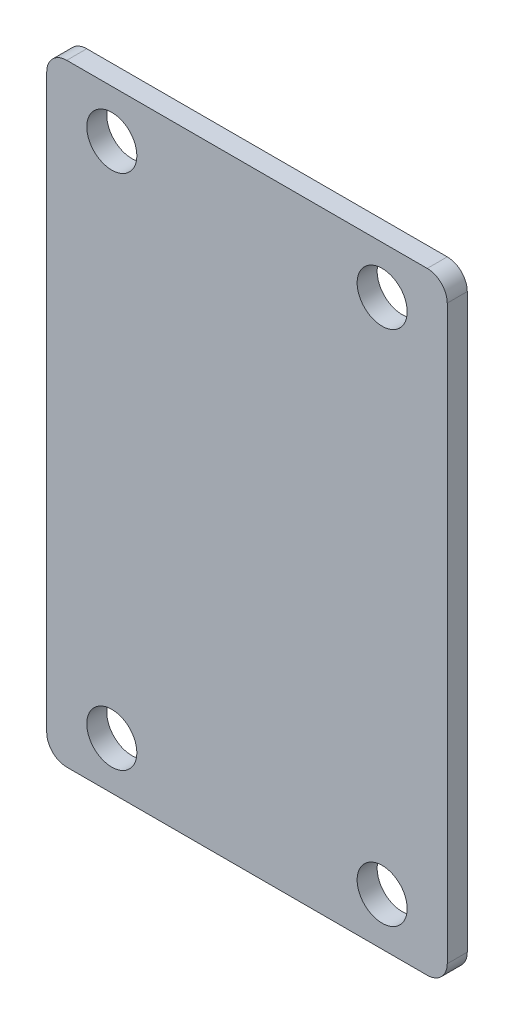
ISO-10303-21;
HEADER;
FILE_DESCRIPTION(('STEP AP214'),'2;1');
FILE_NAME('part.step','',(''),(''),'','','');
FILE_SCHEMA(('AUTOMOTIVE_DESIGN { 1 0 10303 214 1 1 1 1 }'));
ENDSEC;
DATA;
#1=APPLICATION_CONTEXT('core data for automotive mechanical design processes');
#2=APPLICATION_PROTOCOL_DEFINITION('international standard','automotive_design',2000,#1);
#3=PRODUCT_CONTEXT('',#1,'mechanical');
#4=PRODUCT('Part','Part','',(#3));
#5=PRODUCT_RELATED_PRODUCT_CATEGORY('part','',(#4));
#6=PRODUCT_DEFINITION_FORMATION('','',#4);
#7=PRODUCT_DEFINITION_CONTEXT('part definition',#1,'design');
#8=PRODUCT_DEFINITION('design','',#6,#7);
#9=PRODUCT_DEFINITION_SHAPE('','',#8);
#10=(LENGTH_UNIT() NAMED_UNIT(*) SI_UNIT(.MILLI.,.METRE.));
#11=(NAMED_UNIT(*) PLANE_ANGLE_UNIT() SI_UNIT($,.RADIAN.));
#12=(NAMED_UNIT(*) SI_UNIT($,.STERADIAN.) SOLID_ANGLE_UNIT());
#13=UNCERTAINTY_MEASURE_WITH_UNIT(LENGTH_MEASURE(1.E-05),#10,'distance_accuracy_value','');
#14=(GEOMETRIC_REPRESENTATION_CONTEXT(3) GLOBAL_UNCERTAINTY_ASSIGNED_CONTEXT((#13)) GLOBAL_UNIT_ASSIGNED_CONTEXT((#10,
#11,#12)) REPRESENTATION_CONTEXT('',''));
#15=CARTESIAN_POINT('',(0.,0.,0.));
#16=DIRECTION('',(0.,0.,1.));
#17=DIRECTION('',(1.,0.,0.));
#18=AXIS2_PLACEMENT_3D('',#15,#16,#17);
#19=CARTESIAN_POINT('',(-1.,14.2836608964063,1.));
#20=DIRECTION('',(0.,0.,1.));
#21=DIRECTION('',(1.,0.,0.));
#22=AXIS2_PLACEMENT_3D('',#19,#20,#21);
#23=PLANE('',#22);
#24=CARTESIAN_POINT('',(-3.25,12.9080282730666,1.));
#25=DIRECTION('',(0.,0.,1.));
#26=DIRECTION('',(1.,0.,0.));
#27=AXIS2_PLACEMENT_3D('',#24,#25,#26);
#28=CIRCLE('',#27,1.25);
#29=CARTESIAN_POINT('',(-2.,12.9080282730666,1.));
#30=VERTEX_POINT('',#29);
#31=EDGE_CURVE('E194',#30,#30,#28,.T.);
#32=ORIENTED_EDGE('',*,*,#31,.F.);
#33=EDGE_LOOP('',(#32));
#34=FACE_BOUND('',#33,.T.);
#35=CARTESIAN_POINT('',(-16.75,-12.9080282730667,1.));
#36=DIRECTION('',(0.,0.,1.));
#37=DIRECTION('',(1.,0.,0.));
#38=AXIS2_PLACEMENT_3D('',#35,#36,#37);
#39=CIRCLE('',#38,1.25);
#40=CARTESIAN_POINT('',(-15.5,-12.9080282730667,1.));
#41=VERTEX_POINT('',#40);
#42=EDGE_CURVE('E141',#41,#41,#39,.T.);
#43=ORIENTED_EDGE('',*,*,#42,.F.);
#44=EDGE_LOOP('',(#43));
#45=FACE_BOUND('',#44,.T.);
#46=CARTESIAN_POINT('',(-1.,14.2836608964063,1.));
#47=DIRECTION('',(0.,0.,1.));
#48=DIRECTION('',(1.,0.,0.));
#49=AXIS2_PLACEMENT_3D('',#46,#47,#48);
#50=CIRCLE('',#49,1.);
#51=CARTESIAN_POINT('',(0.,14.2836608964063,1.));
#52=VERTEX_POINT('',#51);
#53=CARTESIAN_POINT('',(-1.,15.2836608964063,1.));
#54=VERTEX_POINT('',#53);
#55=EDGE_CURVE('E154',#52,#54,#50,.T.);
#56=ORIENTED_EDGE('',*,*,#55,.T.);
#57=DIRECTION('',(-1.,0.,0.));
#58=VECTOR('',#57,1.);
#59=CARTESIAN_POINT('',(-19.,15.2836608964063,1.));
#60=LINE('',#59,#58);
#61=CARTESIAN_POINT('',(-19.,15.2836608964063,1.));
#62=VERTEX_POINT('',#61);
#63=EDGE_CURVE('E97',#54,#62,#60,.T.);
#64=ORIENTED_EDGE('',*,*,#63,.T.);
#65=CARTESIAN_POINT('',(-19.,14.2836608964063,1.));
#66=DIRECTION('',(0.,0.,1.));
#67=DIRECTION('',(1.,0.,0.));
#68=AXIS2_PLACEMENT_3D('',#65,#66,#67);
#69=CIRCLE('',#68,1.);
#70=CARTESIAN_POINT('',(-20.,14.2836608964063,1.));
#71=VERTEX_POINT('',#70);
#72=EDGE_CURVE('E169',#62,#71,#69,.T.);
#73=ORIENTED_EDGE('',*,*,#72,.T.);
#74=DIRECTION('',(0.,-1.,0.));
#75=VECTOR('',#74,1.);
#76=CARTESIAN_POINT('',(-20.,-7.24669531359351,1.));
#77=LINE('',#76,#75);
#78=CARTESIAN_POINT('',(-20.,-14.2836608964064,1.));
#79=VERTEX_POINT('',#78);
#80=EDGE_CURVE('E179',#71,#79,#77,.T.);
#81=ORIENTED_EDGE('',*,*,#80,.T.);
#82=CARTESIAN_POINT('',(-19.,-14.2836608964064,1.));
#83=DIRECTION('',(0.,0.,1.));
#84=DIRECTION('',(1.,0.,0.));
#85=AXIS2_PLACEMENT_3D('',#82,#83,#84);
#86=CIRCLE('',#85,1.);
#87=CARTESIAN_POINT('',(-19.,-15.2836608964064,1.));
#88=VERTEX_POINT('',#87);
#89=EDGE_CURVE('E117',#79,#88,#86,.T.);
#90=ORIENTED_EDGE('',*,*,#89,.T.);
#91=DIRECTION('',(1.,0.,0.));
#92=VECTOR('',#91,1.);
#93=CARTESIAN_POINT('',(-1.,-15.2836608964064,1.));
#94=LINE('',#93,#92);
#95=CARTESIAN_POINT('',(-1.,-15.2836608964064,1.));
#96=VERTEX_POINT('',#95);
#97=EDGE_CURVE('E110',#88,#96,#94,.T.);
#98=ORIENTED_EDGE('',*,*,#97,.T.);
#99=CARTESIAN_POINT('',(-1.,-14.2836608964064,1.));
#100=DIRECTION('',(0.,0.,1.));
#101=DIRECTION('',(1.,0.,0.));
#102=AXIS2_PLACEMENT_3D('',#99,#100,#101);
#103=CIRCLE('',#102,1.);
#104=CARTESIAN_POINT('',(0.,-14.2836608964064,1.));
#105=VERTEX_POINT('',#104);
#106=EDGE_CURVE('E114',#96,#105,#103,.T.);
#107=ORIENTED_EDGE('',*,*,#106,.T.);
#108=DIRECTION('',(0.,1.,0.));
#109=VECTOR('',#108,1.);
#110=CARTESIAN_POINT('',(0.,-7.24669531359351,1.));
#111=LINE('',#110,#109);
#112=EDGE_CURVE('E56',#105,#52,#111,.T.);
#113=ORIENTED_EDGE('',*,*,#112,.T.);
#114=EDGE_LOOP('',(#56,#64,#73,#81,#90,#98,#107,#113));
#115=FACE_BOUND('',#114,.T.);
#116=CARTESIAN_POINT('',(-3.25,-12.9080282730667,1.));
#117=DIRECTION('',(0.,0.,1.));
#118=DIRECTION('',(1.,0.,0.));
#119=AXIS2_PLACEMENT_3D('',#116,#117,#118);
#120=CIRCLE('',#119,1.25);
#121=CARTESIAN_POINT('',(-2.,-12.9080282730667,1.));
#122=VERTEX_POINT('',#121);
#123=EDGE_CURVE('E188',#122,#122,#120,.T.);
#124=ORIENTED_EDGE('',*,*,#123,.F.);
#125=EDGE_LOOP('',(#124));
#126=FACE_BOUND('',#125,.T.);
#127=CARTESIAN_POINT('',(-16.75,12.9080282730666,1.));
#128=DIRECTION('',(0.,0.,1.));
#129=DIRECTION('',(1.,0.,0.));
#130=AXIS2_PLACEMENT_3D('',#127,#128,#129);
#131=CIRCLE('',#130,1.25);
#132=CARTESIAN_POINT('',(-15.5,12.9080282730666,1.));
#133=VERTEX_POINT('',#132);
#134=EDGE_CURVE('E200',#133,#133,#131,.T.);
#135=ORIENTED_EDGE('',*,*,#134,.F.);
#136=EDGE_LOOP('',(#135));
#137=FACE_BOUND('',#136,.T.);
#138=ADVANCED_FACE('F39',(#34,#45,#115,#126,#137),#23,.T.);
#139=CARTESIAN_POINT('',(-1.,14.2836608964063,0.));
#140=DIRECTION('',(0.,0.,1.));
#141=DIRECTION('',(1.,0.,0.));
#142=AXIS2_PLACEMENT_3D('',#139,#140,#141);
#143=PLANE('',#142);
#144=CARTESIAN_POINT('',(-1.,14.2836608964063,0.));
#145=DIRECTION('',(0.,0.,1.));
#146=DIRECTION('',(1.,0.,0.));
#147=AXIS2_PLACEMENT_3D('',#144,#145,#146);
#148=CIRCLE('',#147,1.);
#149=CARTESIAN_POINT('',(0.,14.2836608964063,0.));
#150=VERTEX_POINT('',#149);
#151=CARTESIAN_POINT('',(-1.,15.2836608964063,0.));
#152=VERTEX_POINT('',#151);
#153=EDGE_CURVE('E137',#150,#152,#148,.T.);
#154=ORIENTED_EDGE('',*,*,#153,.F.);
#155=DIRECTION('',(0.,1.,0.));
#156=VECTOR('',#155,1.);
#157=CARTESIAN_POINT('',(0.,14.2836608964063,0.));
#158=LINE('',#157,#156);
#159=CARTESIAN_POINT('',(0.,-14.2836608964064,0.));
#160=VERTEX_POINT('',#159);
#161=EDGE_CURVE('E85',#160,#150,#158,.T.);
#162=ORIENTED_EDGE('',*,*,#161,.F.);
#163=CARTESIAN_POINT('',(-1.,-14.2836608964064,0.));
#164=DIRECTION('',(0.,0.,1.));
#165=DIRECTION('',(1.,0.,0.));
#166=AXIS2_PLACEMENT_3D('',#163,#164,#165);
#167=CIRCLE('',#166,1.);
#168=CARTESIAN_POINT('',(-1.,-15.2836608964064,0.));
#169=VERTEX_POINT('',#168);
#170=EDGE_CURVE('E151',#169,#160,#167,.T.);
#171=ORIENTED_EDGE('',*,*,#170,.F.);
#172=DIRECTION('',(1.,0.,0.));
#173=VECTOR('',#172,1.);
#174=CARTESIAN_POINT('',(-1.,-15.2836608964064,0.));
#175=LINE('',#174,#173);
#176=CARTESIAN_POINT('',(-19.,-15.2836608964064,0.));
#177=VERTEX_POINT('',#176);
#178=EDGE_CURVE('E126',#177,#169,#175,.T.);
#179=ORIENTED_EDGE('',*,*,#178,.F.);
#180=CARTESIAN_POINT('',(-19.,-14.2836608964064,0.));
#181=DIRECTION('',(0.,0.,1.));
#182=DIRECTION('',(1.,0.,0.));
#183=AXIS2_PLACEMENT_3D('',#180,#181,#182);
#184=CIRCLE('',#183,1.);
#185=CARTESIAN_POINT('',(-20.,-14.2836608964064,0.));
#186=VERTEX_POINT('',#185);
#187=EDGE_CURVE('E148',#186,#177,#184,.T.);
#188=ORIENTED_EDGE('',*,*,#187,.F.);
#189=DIRECTION('',(0.,-1.,0.));
#190=VECTOR('',#189,1.);
#191=CARTESIAN_POINT('',(-20.,-14.2836608964064,0.));
#192=LINE('',#191,#190);
#193=CARTESIAN_POINT('',(-20.,14.2836608964063,0.));
#194=VERTEX_POINT('',#193);
#195=EDGE_CURVE('E146',#194,#186,#192,.T.);
#196=ORIENTED_EDGE('',*,*,#195,.F.);
#197=CARTESIAN_POINT('',(-19.,14.2836608964063,0.));
#198=DIRECTION('',(0.,0.,1.));
#199=DIRECTION('',(1.,0.,0.));
#200=AXIS2_PLACEMENT_3D('',#197,#198,#199);
#201=CIRCLE('',#200,1.);
#202=CARTESIAN_POINT('',(-19.,15.2836608964063,0.));
#203=VERTEX_POINT('',#202);
#204=EDGE_CURVE('E143',#203,#194,#201,.T.);
#205=ORIENTED_EDGE('',*,*,#204,.F.);
#206=DIRECTION('',(-1.,0.,0.));
#207=VECTOR('',#206,1.);
#208=CARTESIAN_POINT('',(-19.,15.2836608964063,0.));
#209=LINE('',#208,#207);
#210=EDGE_CURVE('E140',#152,#203,#209,.T.);
#211=ORIENTED_EDGE('',*,*,#210,.F.);
#212=EDGE_LOOP('',(#154,#162,#171,#179,#188,#196,#205,#211));
#213=FACE_BOUND('',#212,.T.);
#214=CARTESIAN_POINT('',(-16.75,-12.9080282730667,0.));
#215=DIRECTION('',(0.,0.,1.));
#216=DIRECTION('',(1.,0.,0.));
#217=AXIS2_PLACEMENT_3D('',#214,#215,#216);
#218=CIRCLE('',#217,1.25);
#219=CARTESIAN_POINT('',(-15.5,-12.9080282730667,0.));
#220=VERTEX_POINT('',#219);
#221=EDGE_CURVE('E185',#220,#220,#218,.T.);
#222=ORIENTED_EDGE('',*,*,#221,.T.);
#223=EDGE_LOOP('',(#222));
#224=FACE_BOUND('',#223,.T.);
#225=CARTESIAN_POINT('',(-3.25,-12.9080282730667,0.));
#226=DIRECTION('',(0.,0.,1.));
#227=DIRECTION('',(1.,0.,0.));
#228=AXIS2_PLACEMENT_3D('',#225,#226,#227);
#229=CIRCLE('',#228,1.25);
#230=CARTESIAN_POINT('',(-2.,-12.9080282730667,0.));
#231=VERTEX_POINT('',#230);
#232=EDGE_CURVE('E191',#231,#231,#229,.T.);
#233=ORIENTED_EDGE('',*,*,#232,.T.);
#234=EDGE_LOOP('',(#233));
#235=FACE_BOUND('',#234,.T.);
#236=CARTESIAN_POINT('',(-3.25,12.9080282730666,0.));
#237=DIRECTION('',(0.,0.,1.));
#238=DIRECTION('',(1.,0.,0.));
#239=AXIS2_PLACEMENT_3D('',#236,#237,#238);
#240=CIRCLE('',#239,1.25);
#241=CARTESIAN_POINT('',(-2.,12.9080282730666,0.));
#242=VERTEX_POINT('',#241);
#243=EDGE_CURVE('E197',#242,#242,#240,.T.);
#244=ORIENTED_EDGE('',*,*,#243,.T.);
#245=EDGE_LOOP('',(#244));
#246=FACE_BOUND('',#245,.T.);
#247=CARTESIAN_POINT('',(-16.75,12.9080282730666,0.));
#248=DIRECTION('',(0.,0.,1.));
#249=DIRECTION('',(1.,0.,0.));
#250=AXIS2_PLACEMENT_3D('',#247,#248,#249);
#251=CIRCLE('',#250,1.25);
#252=CARTESIAN_POINT('',(-15.5,12.9080282730666,0.));
#253=VERTEX_POINT('',#252);
#254=EDGE_CURVE('E203',#253,#253,#251,.T.);
#255=ORIENTED_EDGE('',*,*,#254,.T.);
#256=EDGE_LOOP('',(#255));
#257=FACE_BOUND('',#256,.T.);
#258=ADVANCED_FACE('F170',(#213,#224,#235,#246,#257),#143,.F.);
#259=CARTESIAN_POINT('',(-1.,14.2836608964063,1.));
#260=DIRECTION('',(0.,0.,-1.));
#261=DIRECTION('',(-1.,0.,0.));
#262=AXIS2_PLACEMENT_3D('',#259,#260,#261);
#263=CYLINDRICAL_SURFACE('',#262,1.);
#264=ORIENTED_EDGE('',*,*,#153,.T.);
#265=DIRECTION('',(0.,0.,-1.));
#266=VECTOR('',#265,1.);
#267=CARTESIAN_POINT('',(-1.,15.2836608964063,1.));
#268=LINE('',#267,#266);
#269=EDGE_CURVE('E11',#54,#152,#268,.T.);
#270=ORIENTED_EDGE('',*,*,#269,.F.);
#271=ORIENTED_EDGE('',*,*,#55,.F.);
#272=DIRECTION('',(0.,0.,-1.));
#273=VECTOR('',#272,1.);
#274=CARTESIAN_POINT('',(0.,14.2836608964063,1.));
#275=LINE('',#274,#273);
#276=EDGE_CURVE('E133',#52,#150,#275,.T.);
#277=ORIENTED_EDGE('',*,*,#276,.T.);
#278=EDGE_LOOP('',(#264,#270,#271,#277));
#279=FACE_BOUND('',#278,.T.);
#280=ADVANCED_FACE('F41',(#279),#263,.T.);
#281=CARTESIAN_POINT('',(-19.,15.2836608964063,1.));
#282=DIRECTION('',(0.,-1.,0.));
#283=DIRECTION('',(0.,0.,-1.));
#284=AXIS2_PLACEMENT_3D('',#281,#282,#283);
#285=PLANE('',#284);
#286=ORIENTED_EDGE('',*,*,#210,.T.);
#287=DIRECTION('',(0.,0.,-1.));
#288=VECTOR('',#287,1.);
#289=CARTESIAN_POINT('',(-19.,15.2836608964063,1.));
#290=LINE('',#289,#288);
#291=EDGE_CURVE('E48',#62,#203,#290,.T.);
#292=ORIENTED_EDGE('',*,*,#291,.F.);
#293=ORIENTED_EDGE('',*,*,#63,.F.);
#294=ORIENTED_EDGE('',*,*,#269,.T.);
#295=EDGE_LOOP('',(#286,#292,#293,#294));
#296=FACE_BOUND('',#295,.T.);
#297=ADVANCED_FACE('F237',(#296),#285,.F.);
#298=CARTESIAN_POINT('',(-19.,14.2836608964063,1.));
#299=DIRECTION('',(0.,0.,-1.));
#300=DIRECTION('',(-1.,0.,0.));
#301=AXIS2_PLACEMENT_3D('',#298,#299,#300);
#302=CYLINDRICAL_SURFACE('',#301,1.);
#303=ORIENTED_EDGE('',*,*,#204,.T.);
#304=DIRECTION('',(0.,0.,-1.));
#305=VECTOR('',#304,1.);
#306=CARTESIAN_POINT('',(-20.,14.2836608964063,1.));
#307=LINE('',#306,#305);
#308=EDGE_CURVE('E161',#71,#194,#307,.T.);
#309=ORIENTED_EDGE('',*,*,#308,.F.);
#310=ORIENTED_EDGE('',*,*,#72,.F.);
#311=ORIENTED_EDGE('',*,*,#291,.T.);
#312=EDGE_LOOP('',(#303,#309,#310,#311));
#313=FACE_BOUND('',#312,.T.);
#314=ADVANCED_FACE('F167',(#313),#302,.T.);
#315=CARTESIAN_POINT('',(-20.,-14.2836608964064,1.));
#316=DIRECTION('',(1.,0.,0.));
#317=DIRECTION('',(0.,0.,-1.));
#318=AXIS2_PLACEMENT_3D('',#315,#316,#317);
#319=PLANE('',#318);
#320=ORIENTED_EDGE('',*,*,#195,.T.);
#321=DIRECTION('',(0.,0.,-1.));
#322=VECTOR('',#321,1.);
#323=CARTESIAN_POINT('',(-20.,-14.2836608964064,1.));
#324=LINE('',#323,#322);
#325=EDGE_CURVE('E158',#79,#186,#324,.T.);
#326=ORIENTED_EDGE('',*,*,#325,.F.);
#327=ORIENTED_EDGE('',*,*,#80,.F.);
#328=ORIENTED_EDGE('',*,*,#308,.T.);
#329=EDGE_LOOP('',(#320,#326,#327,#328));
#330=FACE_BOUND('',#329,.T.);
#331=ADVANCED_FACE('F175',(#330),#319,.F.);
#332=CARTESIAN_POINT('',(-19.,-14.2836608964064,1.));
#333=DIRECTION('',(0.,0.,-1.));
#334=DIRECTION('',(-1.,0.,0.));
#335=AXIS2_PLACEMENT_3D('',#332,#333,#334);
#336=CYLINDRICAL_SURFACE('',#335,1.);
#337=ORIENTED_EDGE('',*,*,#187,.T.);
#338=DIRECTION('',(0.,0.,-1.));
#339=VECTOR('',#338,1.);
#340=CARTESIAN_POINT('',(-19.,-15.2836608964064,1.));
#341=LINE('',#340,#339);
#342=EDGE_CURVE('E128',#88,#177,#341,.T.);
#343=ORIENTED_EDGE('',*,*,#342,.F.);
#344=ORIENTED_EDGE('',*,*,#89,.F.);
#345=ORIENTED_EDGE('',*,*,#325,.T.);
#346=EDGE_LOOP('',(#337,#343,#344,#345));
#347=FACE_BOUND('',#346,.T.);
#348=ADVANCED_FACE('F178',(#347),#336,.T.);
#349=CARTESIAN_POINT('',(-1.,-15.2836608964064,1.));
#350=DIRECTION('',(0.,1.,0.));
#351=DIRECTION('',(0.,0.,1.));
#352=AXIS2_PLACEMENT_3D('',#349,#350,#351);
#353=PLANE('',#352);
#354=ORIENTED_EDGE('',*,*,#178,.T.);
#355=DIRECTION('',(0.,0.,-1.));
#356=VECTOR('',#355,1.);
#357=CARTESIAN_POINT('',(-1.,-15.2836608964064,1.));
#358=LINE('',#357,#356);
#359=EDGE_CURVE('E123',#96,#169,#358,.T.);
#360=ORIENTED_EDGE('',*,*,#359,.F.);
#361=ORIENTED_EDGE('',*,*,#97,.F.);
#362=ORIENTED_EDGE('',*,*,#342,.T.);
#363=EDGE_LOOP('',(#354,#360,#361,#362));
#364=FACE_BOUND('',#363,.T.);
#365=ADVANCED_FACE('F124',(#364),#353,.F.);
#366=CARTESIAN_POINT('',(-1.,-14.2836608964064,1.));
#367=DIRECTION('',(0.,0.,-1.));
#368=DIRECTION('',(-1.,0.,0.));
#369=AXIS2_PLACEMENT_3D('',#366,#367,#368);
#370=CYLINDRICAL_SURFACE('',#369,1.);
#371=ORIENTED_EDGE('',*,*,#170,.T.);
#372=DIRECTION('',(0.,0.,-1.));
#373=VECTOR('',#372,1.);
#374=CARTESIAN_POINT('',(0.,-14.2836608964064,1.));
#375=LINE('',#374,#373);
#376=EDGE_CURVE('E129',#105,#160,#375,.T.);
#377=ORIENTED_EDGE('',*,*,#376,.F.);
#378=ORIENTED_EDGE('',*,*,#106,.F.);
#379=ORIENTED_EDGE('',*,*,#359,.T.);
#380=EDGE_LOOP('',(#371,#377,#378,#379));
#381=FACE_BOUND('',#380,.T.);
#382=ADVANCED_FACE('F131',(#381),#370,.T.);
#383=CARTESIAN_POINT('',(0.,14.2836608964063,1.));
#384=DIRECTION('',(-1.,0.,0.));
#385=DIRECTION('',(0.,0.,1.));
#386=AXIS2_PLACEMENT_3D('',#383,#384,#385);
#387=PLANE('',#386);
#388=ORIENTED_EDGE('',*,*,#161,.T.);
#389=ORIENTED_EDGE('',*,*,#276,.F.);
#390=ORIENTED_EDGE('',*,*,#112,.F.);
#391=ORIENTED_EDGE('',*,*,#376,.T.);
#392=EDGE_LOOP('',(#388,#389,#390,#391));
#393=FACE_BOUND('',#392,.T.);
#394=ADVANCED_FACE('F225',(#393),#387,.F.);
#395=CARTESIAN_POINT('',(-16.75,-12.9080282730667,1.));
#396=DIRECTION('',(0.,0.,-1.));
#397=DIRECTION('',(-1.,0.,0.));
#398=AXIS2_PLACEMENT_3D('',#395,#396,#397);
#399=CYLINDRICAL_SURFACE('',#398,1.25);
#400=ORIENTED_EDGE('',*,*,#42,.T.);
#401=EDGE_LOOP('',(#400));
#402=FACE_BOUND('',#401,.T.);
#403=ORIENTED_EDGE('',*,*,#221,.F.);
#404=EDGE_LOOP('',(#403));
#405=FACE_BOUND('',#404,.T.);
#406=ADVANCED_FACE('F222',(#402,#405),#399,.F.);
#407=CARTESIAN_POINT('',(-3.25,-12.9080282730667,1.));
#408=DIRECTION('',(0.,0.,-1.));
#409=DIRECTION('',(-1.,0.,0.));
#410=AXIS2_PLACEMENT_3D('',#407,#408,#409);
#411=CYLINDRICAL_SURFACE('',#410,1.25);
#412=ORIENTED_EDGE('',*,*,#123,.T.);
#413=EDGE_LOOP('',(#412));
#414=FACE_BOUND('',#413,.T.);
#415=ORIENTED_EDGE('',*,*,#232,.F.);
#416=EDGE_LOOP('',(#415));
#417=FACE_BOUND('',#416,.T.);
#418=ADVANCED_FACE('F302',(#414,#417),#411,.F.);
#419=CARTESIAN_POINT('',(-3.25,12.9080282730666,1.));
#420=DIRECTION('',(0.,0.,-1.));
#421=DIRECTION('',(-1.,0.,0.));
#422=AXIS2_PLACEMENT_3D('',#419,#420,#421);
#423=CYLINDRICAL_SURFACE('',#422,1.25);
#424=ORIENTED_EDGE('',*,*,#31,.T.);
#425=EDGE_LOOP('',(#424));
#426=FACE_BOUND('',#425,.T.);
#427=ORIENTED_EDGE('',*,*,#243,.F.);
#428=EDGE_LOOP('',(#427));
#429=FACE_BOUND('',#428,.T.);
#430=ADVANCED_FACE('F310',(#426,#429),#423,.F.);
#431=CARTESIAN_POINT('',(-16.75,12.9080282730666,1.));
#432=DIRECTION('',(0.,0.,-1.));
#433=DIRECTION('',(-1.,0.,0.));
#434=AXIS2_PLACEMENT_3D('',#431,#432,#433);
#435=CYLINDRICAL_SURFACE('',#434,1.25);
#436=ORIENTED_EDGE('',*,*,#134,.T.);
#437=EDGE_LOOP('',(#436));
#438=FACE_BOUND('',#437,.T.);
#439=ORIENTED_EDGE('',*,*,#254,.F.);
#440=EDGE_LOOP('',(#439));
#441=FACE_BOUND('',#440,.T.);
#442=ADVANCED_FACE('F209',(#438,#441),#435,.F.);
#443=CLOSED_SHELL('',(#138,#258,#280,#297,#314,#331,#348,#365,#382,#394,#406,#418,#430,#442));
#444=MANIFOLD_SOLID_BREP('B2',#443);
#445=ADVANCED_BREP_SHAPE_REPRESENTATION('',(#18,#444),#14);
#446=SHAPE_DEFINITION_REPRESENTATION(#9,#445);
ENDSEC;
END-ISO-10303-21;
